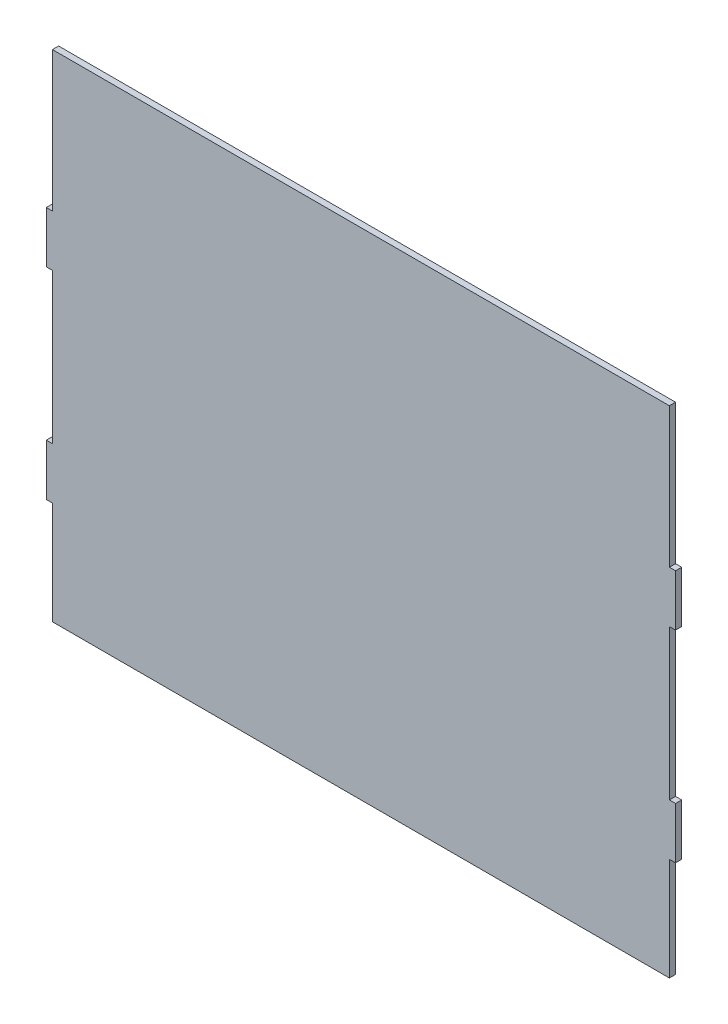
ISO-10303-21;
HEADER;
FILE_DESCRIPTION(('STEP AP214'),'2;1');
FILE_NAME('part.step','',(''),(''),'','','');
FILE_SCHEMA(('AUTOMOTIVE_DESIGN { 1 0 10303 214 1 1 1 1 }'));
ENDSEC;
DATA;
#1=APPLICATION_CONTEXT('core data for automotive mechanical design processes');
#2=APPLICATION_PROTOCOL_DEFINITION('international standard','automotive_design',2000,#1);
#3=PRODUCT_CONTEXT('',#1,'mechanical');
#4=PRODUCT('Part','Part','',(#3));
#5=PRODUCT_RELATED_PRODUCT_CATEGORY('part','',(#4));
#6=PRODUCT_DEFINITION_FORMATION('','',#4);
#7=PRODUCT_DEFINITION_CONTEXT('part definition',#1,'design');
#8=PRODUCT_DEFINITION('design','',#6,#7);
#9=PRODUCT_DEFINITION_SHAPE('','',#8);
#10=(LENGTH_UNIT() NAMED_UNIT(*) SI_UNIT(.MILLI.,.METRE.));
#11=(NAMED_UNIT(*) PLANE_ANGLE_UNIT() SI_UNIT($,.RADIAN.));
#12=(NAMED_UNIT(*) SI_UNIT($,.STERADIAN.) SOLID_ANGLE_UNIT());
#13=UNCERTAINTY_MEASURE_WITH_UNIT(LENGTH_MEASURE(1.E-05),#10,'distance_accuracy_value','');
#14=(GEOMETRIC_REPRESENTATION_CONTEXT(3) GLOBAL_UNCERTAINTY_ASSIGNED_CONTEXT((#13)) GLOBAL_UNIT_ASSIGNED_CONTEXT((#10,
#11,#12)) REPRESENTATION_CONTEXT('',''));
#15=CARTESIAN_POINT('',(0.,0.,0.));
#16=DIRECTION('',(0.,0.,1.));
#17=DIRECTION('',(1.,0.,0.));
#18=AXIS2_PLACEMENT_3D('',#15,#16,#17);
#19=CARTESIAN_POINT('',(300.,-241.,6.));
#20=DIRECTION('',(-1.,0.,0.));
#21=DIRECTION('',(0.,-1.,0.));
#22=AXIS2_PLACEMENT_3D('',#19,#20,#21);
#23=PLANE('',#22);
#24=DIRECTION('',(0.,1.,0.));
#25=VECTOR('',#24,1.);
#26=CARTESIAN_POINT('',(300.,-241.,0.));
#27=LINE('',#26,#25);
#28=CARTESIAN_POINT('',(300.,-241.,0.));
#29=VERTEX_POINT('',#28);
#30=CARTESIAN_POINT('',(300.,-141.,0.));
#31=VERTEX_POINT('',#30);
#32=EDGE_CURVE('E201',#29,#31,#27,.T.);
#33=ORIENTED_EDGE('',*,*,#32,.T.);
#34=DIRECTION('',(0.,0.,-1.));
#35=VECTOR('',#34,1.);
#36=CARTESIAN_POINT('',(300.,-141.,6.));
#37=LINE('',#36,#35);
#38=CARTESIAN_POINT('',(300.,-141.,6.));
#39=VERTEX_POINT('',#38);
#40=EDGE_CURVE('E11',#39,#31,#37,.T.);
#41=ORIENTED_EDGE('',*,*,#40,.F.);
#42=DIRECTION('',(0.,1.,0.));
#43=VECTOR('',#42,1.);
#44=CARTESIAN_POINT('',(300.,-241.,6.));
#45=LINE('',#44,#43);
#46=CARTESIAN_POINT('',(300.,-241.,6.));
#47=VERTEX_POINT('',#46);
#48=EDGE_CURVE('E239',#47,#39,#45,.T.);
#49=ORIENTED_EDGE('',*,*,#48,.F.);
#50=DIRECTION('',(0.,0.,-1.));
#51=VECTOR('',#50,1.);
#52=CARTESIAN_POINT('',(300.,-241.,6.));
#53=LINE('',#52,#51);
#54=EDGE_CURVE('E197',#47,#29,#53,.T.);
#55=ORIENTED_EDGE('',*,*,#54,.T.);
#56=EDGE_LOOP('',(#33,#41,#49,#55));
#57=FACE_BOUND('',#56,.T.);
#58=ADVANCED_FACE('F33',(#57),#23,.F.);
#59=CARTESIAN_POINT('',(300.,-141.,6.));
#60=DIRECTION('',(0.,1.,0.));
#61=DIRECTION('',(0.,0.,1.));
#62=AXIS2_PLACEMENT_3D('',#59,#60,#61);
#63=PLANE('',#62);
#64=DIRECTION('',(1.,0.,0.));
#65=VECTOR('',#64,1.);
#66=CARTESIAN_POINT('',(300.,-141.,0.));
#67=LINE('',#66,#65);
#68=CARTESIAN_POINT('',(306.,-141.,0.));
#69=VERTEX_POINT('',#68);
#70=EDGE_CURVE('E204',#31,#69,#67,.T.);
#71=ORIENTED_EDGE('',*,*,#70,.T.);
#72=DIRECTION('',(0.,0.,-1.));
#73=VECTOR('',#72,1.);
#74=CARTESIAN_POINT('',(306.,-141.,6.));
#75=LINE('',#74,#73);
#76=CARTESIAN_POINT('',(306.,-141.,6.));
#77=VERTEX_POINT('',#76);
#78=EDGE_CURVE('E41',#77,#69,#75,.T.);
#79=ORIENTED_EDGE('',*,*,#78,.F.);
#80=DIRECTION('',(1.,0.,0.));
#81=VECTOR('',#80,1.);
#82=CARTESIAN_POINT('',(300.,-141.,6.));
#83=LINE('',#82,#81);
#84=EDGE_CURVE('E128',#39,#77,#83,.T.);
#85=ORIENTED_EDGE('',*,*,#84,.F.);
#86=ORIENTED_EDGE('',*,*,#40,.T.);
#87=EDGE_LOOP('',(#71,#79,#85,#86));
#88=FACE_BOUND('',#87,.T.);
#89=ADVANCED_FACE('F357',(#88),#63,.F.);
#90=CARTESIAN_POINT('',(306.,-141.,6.));
#91=DIRECTION('',(-1.,0.,0.));
#92=DIRECTION('',(0.,0.,1.));
#93=AXIS2_PLACEMENT_3D('',#90,#91,#92);
#94=PLANE('',#93);
#95=DIRECTION('',(0.,1.,0.));
#96=VECTOR('',#95,1.);
#97=CARTESIAN_POINT('',(306.,-141.,0.));
#98=LINE('',#97,#96);
#99=CARTESIAN_POINT('',(306.,-90.9999999999999,0.));
#100=VERTEX_POINT('',#99);
#101=EDGE_CURVE('E206',#69,#100,#98,.T.);
#102=ORIENTED_EDGE('',*,*,#101,.T.);
#103=DIRECTION('',(0.,0.,-1.));
#104=VECTOR('',#103,1.);
#105=CARTESIAN_POINT('',(306.,-90.9999999999999,6.));
#106=LINE('',#105,#104);
#107=CARTESIAN_POINT('',(306.,-90.9999999999999,6.));
#108=VERTEX_POINT('',#107);
#109=EDGE_CURVE('E282',#108,#100,#106,.T.);
#110=ORIENTED_EDGE('',*,*,#109,.F.);
#111=DIRECTION('',(0.,1.,0.));
#112=VECTOR('',#111,1.);
#113=CARTESIAN_POINT('',(306.,-141.,6.));
#114=LINE('',#113,#112);
#115=EDGE_CURVE('E290',#77,#108,#114,.T.);
#116=ORIENTED_EDGE('',*,*,#115,.F.);
#117=ORIENTED_EDGE('',*,*,#78,.T.);
#118=EDGE_LOOP('',(#102,#110,#116,#117));
#119=FACE_BOUND('',#118,.T.);
#120=ADVANCED_FACE('F288',(#119),#94,.F.);
#121=CARTESIAN_POINT('',(306.,-90.9999999999999,6.));
#122=DIRECTION('',(0.,-1.,0.));
#123=DIRECTION('',(0.,0.,-1.));
#124=AXIS2_PLACEMENT_3D('',#121,#122,#123);
#125=PLANE('',#124);
#126=DIRECTION('',(-1.,0.,0.));
#127=VECTOR('',#126,1.);
#128=CARTESIAN_POINT('',(306.,-90.9999999999999,0.));
#129=LINE('',#128,#127);
#130=CARTESIAN_POINT('',(300.,-90.9999999999999,0.));
#131=VERTEX_POINT('',#130);
#132=EDGE_CURVE('E208',#100,#131,#129,.T.);
#133=ORIENTED_EDGE('',*,*,#132,.T.);
#134=DIRECTION('',(0.,0.,-1.));
#135=VECTOR('',#134,1.);
#136=CARTESIAN_POINT('',(300.,-90.9999999999999,6.));
#137=LINE('',#136,#135);
#138=CARTESIAN_POINT('',(300.,-90.9999999999999,6.));
#139=VERTEX_POINT('',#138);
#140=EDGE_CURVE('E279',#139,#131,#137,.T.);
#141=ORIENTED_EDGE('',*,*,#140,.F.);
#142=DIRECTION('',(-1.,0.,0.));
#143=VECTOR('',#142,1.);
#144=CARTESIAN_POINT('',(306.,-90.9999999999999,6.));
#145=LINE('',#144,#143);
#146=EDGE_CURVE('E308',#108,#139,#145,.T.);
#147=ORIENTED_EDGE('',*,*,#146,.F.);
#148=ORIENTED_EDGE('',*,*,#109,.T.);
#149=EDGE_LOOP('',(#133,#141,#147,#148));
#150=FACE_BOUND('',#149,.T.);
#151=ADVANCED_FACE('F299',(#150),#125,.F.);
#152=CARTESIAN_POINT('',(300.,55.,6.));
#153=DIRECTION('',(-1.,0.,0.));
#154=DIRECTION('',(0.,-1.,0.));
#155=AXIS2_PLACEMENT_3D('',#152,#153,#154);
#156=PLANE('',#155);
#157=DIRECTION('',(0.,1.,0.));
#158=VECTOR('',#157,1.);
#159=CARTESIAN_POINT('',(300.,55.,0.));
#160=LINE('',#159,#158);
#161=CARTESIAN_POINT('',(300.,55.,0.));
#162=VERTEX_POINT('',#161);
#163=EDGE_CURVE('E210',#131,#162,#160,.T.);
#164=ORIENTED_EDGE('',*,*,#163,.T.);
#165=DIRECTION('',(0.,0.,-1.));
#166=VECTOR('',#165,1.);
#167=CARTESIAN_POINT('',(300.,55.,6.));
#168=LINE('',#167,#166);
#169=CARTESIAN_POINT('',(300.,55.,6.));
#170=VERTEX_POINT('',#169);
#171=EDGE_CURVE('E276',#170,#162,#168,.T.);
#172=ORIENTED_EDGE('',*,*,#171,.F.);
#173=DIRECTION('',(0.,1.,0.));
#174=VECTOR('',#173,1.);
#175=CARTESIAN_POINT('',(300.,55.,6.));
#176=LINE('',#175,#174);
#177=EDGE_CURVE('E305',#139,#170,#176,.T.);
#178=ORIENTED_EDGE('',*,*,#177,.F.);
#179=ORIENTED_EDGE('',*,*,#140,.T.);
#180=EDGE_LOOP('',(#164,#172,#178,#179));
#181=FACE_BOUND('',#180,.T.);
#182=ADVANCED_FACE('F303',(#181),#156,.F.);
#183=CARTESIAN_POINT('',(306.,55.,6.));
#184=DIRECTION('',(0.,1.,0.));
#185=DIRECTION('',(0.,0.,1.));
#186=AXIS2_PLACEMENT_3D('',#183,#184,#185);
#187=PLANE('',#186);
#188=DIRECTION('',(1.,0.,0.));
#189=VECTOR('',#188,1.);
#190=CARTESIAN_POINT('',(306.,55.,0.));
#191=LINE('',#190,#189);
#192=CARTESIAN_POINT('',(306.,55.,0.));
#193=VERTEX_POINT('',#192);
#194=EDGE_CURVE('E212',#162,#193,#191,.T.);
#195=ORIENTED_EDGE('',*,*,#194,.T.);
#196=DIRECTION('',(0.,0.,-1.));
#197=VECTOR('',#196,1.);
#198=CARTESIAN_POINT('',(306.,55.,6.));
#199=LINE('',#198,#197);
#200=CARTESIAN_POINT('',(306.,55.,6.));
#201=VERTEX_POINT('',#200);
#202=EDGE_CURVE('E273',#201,#193,#199,.T.);
#203=ORIENTED_EDGE('',*,*,#202,.F.);
#204=DIRECTION('',(1.,0.,0.));
#205=VECTOR('',#204,1.);
#206=CARTESIAN_POINT('',(306.,55.,6.));
#207=LINE('',#206,#205);
#208=EDGE_CURVE('E307',#170,#201,#207,.T.);
#209=ORIENTED_EDGE('',*,*,#208,.F.);
#210=ORIENTED_EDGE('',*,*,#171,.T.);
#211=EDGE_LOOP('',(#195,#203,#209,#210));
#212=FACE_BOUND('',#211,.T.);
#213=ADVANCED_FACE('F370',(#212),#187,.F.);
#214=CARTESIAN_POINT('',(306.,105.,6.));
#215=DIRECTION('',(-1.,0.,0.));
#216=DIRECTION('',(0.,0.,1.));
#217=AXIS2_PLACEMENT_3D('',#214,#215,#216);
#218=PLANE('',#217);
#219=DIRECTION('',(0.,1.,0.));
#220=VECTOR('',#219,1.);
#221=CARTESIAN_POINT('',(306.,105.,0.));
#222=LINE('',#221,#220);
#223=CARTESIAN_POINT('',(306.,105.,0.));
#224=VERTEX_POINT('',#223);
#225=EDGE_CURVE('E214',#193,#224,#222,.T.);
#226=ORIENTED_EDGE('',*,*,#225,.T.);
#227=DIRECTION('',(0.,0.,-1.));
#228=VECTOR('',#227,1.);
#229=CARTESIAN_POINT('',(306.,105.,6.));
#230=LINE('',#229,#228);
#231=CARTESIAN_POINT('',(306.,105.,6.));
#232=VERTEX_POINT('',#231);
#233=EDGE_CURVE('E270',#232,#224,#230,.T.);
#234=ORIENTED_EDGE('',*,*,#233,.F.);
#235=DIRECTION('',(0.,1.,0.));
#236=VECTOR('',#235,1.);
#237=CARTESIAN_POINT('',(306.,105.,6.));
#238=LINE('',#237,#236);
#239=EDGE_CURVE('E310',#201,#232,#238,.T.);
#240=ORIENTED_EDGE('',*,*,#239,.F.);
#241=ORIENTED_EDGE('',*,*,#202,.T.);
#242=EDGE_LOOP('',(#226,#234,#240,#241));
#243=FACE_BOUND('',#242,.T.);
#244=ADVANCED_FACE('F373',(#243),#218,.F.);
#245=CARTESIAN_POINT('',(306.,105.,6.));
#246=DIRECTION('',(0.,-1.,0.));
#247=DIRECTION('',(1.,0.,0.));
#248=AXIS2_PLACEMENT_3D('',#245,#246,#247);
#249=PLANE('',#248);
#250=DIRECTION('',(-1.,0.,0.));
#251=VECTOR('',#250,1.);
#252=CARTESIAN_POINT('',(306.,105.,0.));
#253=LINE('',#252,#251);
#254=CARTESIAN_POINT('',(300.,105.,0.));
#255=VERTEX_POINT('',#254);
#256=EDGE_CURVE('E216',#224,#255,#253,.T.);
#257=ORIENTED_EDGE('',*,*,#256,.T.);
#258=DIRECTION('',(0.,0.,-1.));
#259=VECTOR('',#258,1.);
#260=CARTESIAN_POINT('',(300.,105.,6.));
#261=LINE('',#260,#259);
#262=CARTESIAN_POINT('',(300.,105.,6.));
#263=VERTEX_POINT('',#262);
#264=EDGE_CURVE('E267',#263,#255,#261,.T.);
#265=ORIENTED_EDGE('',*,*,#264,.F.);
#266=DIRECTION('',(-1.,0.,0.));
#267=VECTOR('',#266,1.);
#268=CARTESIAN_POINT('',(306.,105.,6.));
#269=LINE('',#268,#267);
#270=EDGE_CURVE('E316',#232,#263,#269,.T.);
#271=ORIENTED_EDGE('',*,*,#270,.F.);
#272=ORIENTED_EDGE('',*,*,#233,.T.);
#273=EDGE_LOOP('',(#257,#265,#271,#272));
#274=FACE_BOUND('',#273,.T.);
#275=ADVANCED_FACE('F377',(#274),#249,.F.);
#276=CARTESIAN_POINT('',(300.,241.,6.));
#277=DIRECTION('',(-1.,0.,0.));
#278=DIRECTION('',(0.,0.,1.));
#279=AXIS2_PLACEMENT_3D('',#276,#277,#278);
#280=PLANE('',#279);
#281=DIRECTION('',(0.,1.,0.));
#282=VECTOR('',#281,1.);
#283=CARTESIAN_POINT('',(300.,241.,0.));
#284=LINE('',#283,#282);
#285=CARTESIAN_POINT('',(300.,241.,0.));
#286=VERTEX_POINT('',#285);
#287=EDGE_CURVE('E218',#255,#286,#284,.T.);
#288=ORIENTED_EDGE('',*,*,#287,.T.);
#289=DIRECTION('',(0.,0.,-1.));
#290=VECTOR('',#289,1.);
#291=CARTESIAN_POINT('',(300.,241.,6.));
#292=LINE('',#291,#290);
#293=CARTESIAN_POINT('',(300.,241.,6.));
#294=VERTEX_POINT('',#293);
#295=EDGE_CURVE('E264',#294,#286,#292,.T.);
#296=ORIENTED_EDGE('',*,*,#295,.F.);
#297=DIRECTION('',(0.,1.,0.));
#298=VECTOR('',#297,1.);
#299=CARTESIAN_POINT('',(300.,241.,6.));
#300=LINE('',#299,#298);
#301=EDGE_CURVE('E318',#263,#294,#300,.T.);
#302=ORIENTED_EDGE('',*,*,#301,.F.);
#303=ORIENTED_EDGE('',*,*,#264,.T.);
#304=EDGE_LOOP('',(#288,#296,#302,#303));
#305=FACE_BOUND('',#304,.T.);
#306=ADVANCED_FACE('F381',(#305),#280,.F.);
#307=CARTESIAN_POINT('',(-300.,241.,6.));
#308=DIRECTION('',(0.,-1.,0.));
#309=DIRECTION('',(1.,0.,0.));
#310=AXIS2_PLACEMENT_3D('',#307,#308,#309);
#311=PLANE('',#310);
#312=DIRECTION('',(-1.,0.,0.));
#313=VECTOR('',#312,1.);
#314=CARTESIAN_POINT('',(-300.,241.,0.));
#315=LINE('',#314,#313);
#316=CARTESIAN_POINT('',(-300.,241.,0.));
#317=VERTEX_POINT('',#316);
#318=EDGE_CURVE('E220',#286,#317,#315,.T.);
#319=ORIENTED_EDGE('',*,*,#318,.T.);
#320=DIRECTION('',(0.,0.,-1.));
#321=VECTOR('',#320,1.);
#322=CARTESIAN_POINT('',(-300.,241.,6.));
#323=LINE('',#322,#321);
#324=CARTESIAN_POINT('',(-300.,241.,6.));
#325=VERTEX_POINT('',#324);
#326=EDGE_CURVE('E261',#325,#317,#323,.T.);
#327=ORIENTED_EDGE('',*,*,#326,.F.);
#328=DIRECTION('',(-1.,0.,0.));
#329=VECTOR('',#328,1.);
#330=CARTESIAN_POINT('',(-300.,241.,6.));
#331=LINE('',#330,#329);
#332=EDGE_CURVE('E320',#294,#325,#331,.T.);
#333=ORIENTED_EDGE('',*,*,#332,.F.);
#334=ORIENTED_EDGE('',*,*,#295,.T.);
#335=EDGE_LOOP('',(#319,#327,#333,#334));
#336=FACE_BOUND('',#335,.T.);
#337=ADVANCED_FACE('F385',(#336),#311,.F.);
#338=CARTESIAN_POINT('',(-300.,241.,6.));
#339=DIRECTION('',(1.,0.,0.));
#340=DIRECTION('',(0.,0.,-1.));
#341=AXIS2_PLACEMENT_3D('',#338,#339,#340);
#342=PLANE('',#341);
#343=DIRECTION('',(0.,-1.,0.));
#344=VECTOR('',#343,1.);
#345=CARTESIAN_POINT('',(-300.,241.,0.));
#346=LINE('',#345,#344);
#347=CARTESIAN_POINT('',(-300.,105.,0.));
#348=VERTEX_POINT('',#347);
#349=EDGE_CURVE('E222',#317,#348,#346,.T.);
#350=ORIENTED_EDGE('',*,*,#349,.T.);
#351=DIRECTION('',(0.,0.,-1.));
#352=VECTOR('',#351,1.);
#353=CARTESIAN_POINT('',(-300.,105.,6.));
#354=LINE('',#353,#352);
#355=CARTESIAN_POINT('',(-300.,105.,6.));
#356=VERTEX_POINT('',#355);
#357=EDGE_CURVE('E258',#356,#348,#354,.T.);
#358=ORIENTED_EDGE('',*,*,#357,.F.);
#359=DIRECTION('',(0.,-1.,0.));
#360=VECTOR('',#359,1.);
#361=CARTESIAN_POINT('',(-300.,241.,6.));
#362=LINE('',#361,#360);
#363=EDGE_CURVE('E322',#325,#356,#362,.T.);
#364=ORIENTED_EDGE('',*,*,#363,.F.);
#365=ORIENTED_EDGE('',*,*,#326,.T.);
#366=EDGE_LOOP('',(#350,#358,#364,#365));
#367=FACE_BOUND('',#366,.T.);
#368=ADVANCED_FACE('F389',(#367),#342,.F.);
#369=CARTESIAN_POINT('',(-306.,105.,6.));
#370=DIRECTION('',(0.,-1.,0.));
#371=DIRECTION('',(0.,0.,-1.));
#372=AXIS2_PLACEMENT_3D('',#369,#370,#371);
#373=PLANE('',#372);
#374=DIRECTION('',(-1.,0.,0.));
#375=VECTOR('',#374,1.);
#376=CARTESIAN_POINT('',(-306.,105.,0.));
#377=LINE('',#376,#375);
#378=CARTESIAN_POINT('',(-306.,105.,0.));
#379=VERTEX_POINT('',#378);
#380=EDGE_CURVE('E224',#348,#379,#377,.T.);
#381=ORIENTED_EDGE('',*,*,#380,.T.);
#382=DIRECTION('',(0.,0.,-1.));
#383=VECTOR('',#382,1.);
#384=CARTESIAN_POINT('',(-306.,105.,6.));
#385=LINE('',#384,#383);
#386=CARTESIAN_POINT('',(-306.,105.,6.));
#387=VERTEX_POINT('',#386);
#388=EDGE_CURVE('E255',#387,#379,#385,.T.);
#389=ORIENTED_EDGE('',*,*,#388,.F.);
#390=DIRECTION('',(-1.,0.,0.));
#391=VECTOR('',#390,1.);
#392=CARTESIAN_POINT('',(-306.,105.,6.));
#393=LINE('',#392,#391);
#394=EDGE_CURVE('E324',#356,#387,#393,.T.);
#395=ORIENTED_EDGE('',*,*,#394,.F.);
#396=ORIENTED_EDGE('',*,*,#357,.T.);
#397=EDGE_LOOP('',(#381,#389,#395,#396));
#398=FACE_BOUND('',#397,.T.);
#399=ADVANCED_FACE('F393',(#398),#373,.F.);
#400=CARTESIAN_POINT('',(-306.,105.,6.));
#401=DIRECTION('',(1.,0.,0.));
#402=DIRECTION('',(0.,0.,-1.));
#403=AXIS2_PLACEMENT_3D('',#400,#401,#402);
#404=PLANE('',#403);
#405=DIRECTION('',(0.,-1.,0.));
#406=VECTOR('',#405,1.);
#407=CARTESIAN_POINT('',(-306.,105.,0.));
#408=LINE('',#407,#406);
#409=CARTESIAN_POINT('',(-306.,55.,0.));
#410=VERTEX_POINT('',#409);
#411=EDGE_CURVE('E226',#379,#410,#408,.T.);
#412=ORIENTED_EDGE('',*,*,#411,.T.);
#413=DIRECTION('',(0.,0.,-1.));
#414=VECTOR('',#413,1.);
#415=CARTESIAN_POINT('',(-306.,55.,6.));
#416=LINE('',#415,#414);
#417=CARTESIAN_POINT('',(-306.,55.,6.));
#418=VERTEX_POINT('',#417);
#419=EDGE_CURVE('E252',#418,#410,#416,.T.);
#420=ORIENTED_EDGE('',*,*,#419,.F.);
#421=DIRECTION('',(0.,-1.,0.));
#422=VECTOR('',#421,1.);
#423=CARTESIAN_POINT('',(-306.,105.,6.));
#424=LINE('',#423,#422);
#425=EDGE_CURVE('E326',#387,#418,#424,.T.);
#426=ORIENTED_EDGE('',*,*,#425,.F.);
#427=ORIENTED_EDGE('',*,*,#388,.T.);
#428=EDGE_LOOP('',(#412,#420,#426,#427));
#429=FACE_BOUND('',#428,.T.);
#430=ADVANCED_FACE('F397',(#429),#404,.F.);
#431=CARTESIAN_POINT('',(-306.,55.,6.));
#432=DIRECTION('',(0.,1.,0.));
#433=DIRECTION('',(0.,0.,1.));
#434=AXIS2_PLACEMENT_3D('',#431,#432,#433);
#435=PLANE('',#434);
#436=DIRECTION('',(1.,0.,0.));
#437=VECTOR('',#436,1.);
#438=CARTESIAN_POINT('',(-306.,55.,0.));
#439=LINE('',#438,#437);
#440=CARTESIAN_POINT('',(-300.,55.,0.));
#441=VERTEX_POINT('',#440);
#442=EDGE_CURVE('E228',#410,#441,#439,.T.);
#443=ORIENTED_EDGE('',*,*,#442,.T.);
#444=DIRECTION('',(0.,0.,-1.));
#445=VECTOR('',#444,1.);
#446=CARTESIAN_POINT('',(-300.,55.,6.));
#447=LINE('',#446,#445);
#448=CARTESIAN_POINT('',(-300.,55.,6.));
#449=VERTEX_POINT('',#448);
#450=EDGE_CURVE('E249',#449,#441,#447,.T.);
#451=ORIENTED_EDGE('',*,*,#450,.F.);
#452=DIRECTION('',(1.,0.,0.));
#453=VECTOR('',#452,1.);
#454=CARTESIAN_POINT('',(-306.,55.,6.));
#455=LINE('',#454,#453);
#456=EDGE_CURVE('E328',#418,#449,#455,.T.);
#457=ORIENTED_EDGE('',*,*,#456,.F.);
#458=ORIENTED_EDGE('',*,*,#419,.T.);
#459=EDGE_LOOP('',(#443,#451,#457,#458));
#460=FACE_BOUND('',#459,.T.);
#461=ADVANCED_FACE('F401',(#460),#435,.F.);
#462=CARTESIAN_POINT('',(-300.,55.,6.));
#463=DIRECTION('',(1.,0.,0.));
#464=DIRECTION('',(0.,0.,-1.));
#465=AXIS2_PLACEMENT_3D('',#462,#463,#464);
#466=PLANE('',#465);
#467=DIRECTION('',(0.,-1.,0.));
#468=VECTOR('',#467,1.);
#469=CARTESIAN_POINT('',(-300.,55.,0.));
#470=LINE('',#469,#468);
#471=CARTESIAN_POINT('',(-300.,-91.,0.));
#472=VERTEX_POINT('',#471);
#473=EDGE_CURVE('E230',#441,#472,#470,.T.);
#474=ORIENTED_EDGE('',*,*,#473,.T.);
#475=DIRECTION('',(0.,0.,-1.));
#476=VECTOR('',#475,1.);
#477=CARTESIAN_POINT('',(-300.,-91.,6.));
#478=LINE('',#477,#476);
#479=CARTESIAN_POINT('',(-300.,-91.,6.));
#480=VERTEX_POINT('',#479);
#481=EDGE_CURVE('E246',#480,#472,#478,.T.);
#482=ORIENTED_EDGE('',*,*,#481,.F.);
#483=DIRECTION('',(0.,-1.,0.));
#484=VECTOR('',#483,1.);
#485=CARTESIAN_POINT('',(-300.,55.,6.));
#486=LINE('',#485,#484);
#487=EDGE_CURVE('E330',#449,#480,#486,.T.);
#488=ORIENTED_EDGE('',*,*,#487,.F.);
#489=ORIENTED_EDGE('',*,*,#450,.T.);
#490=EDGE_LOOP('',(#474,#482,#488,#489));
#491=FACE_BOUND('',#490,.T.);
#492=ADVANCED_FACE('F405',(#491),#466,.F.);
#493=CARTESIAN_POINT('',(-306.,-91.,6.));
#494=DIRECTION('',(0.,-1.,0.));
#495=DIRECTION('',(0.,0.,-1.));
#496=AXIS2_PLACEMENT_3D('',#493,#494,#495);
#497=PLANE('',#496);
#498=DIRECTION('',(-1.,0.,0.));
#499=VECTOR('',#498,1.);
#500=CARTESIAN_POINT('',(-306.,-91.,0.));
#501=LINE('',#500,#499);
#502=CARTESIAN_POINT('',(-306.,-91.,0.));
#503=VERTEX_POINT('',#502);
#504=EDGE_CURVE('E232',#472,#503,#501,.T.);
#505=ORIENTED_EDGE('',*,*,#504,.T.);
#506=DIRECTION('',(0.,0.,-1.));
#507=VECTOR('',#506,1.);
#508=CARTESIAN_POINT('',(-306.,-91.,6.));
#509=LINE('',#508,#507);
#510=CARTESIAN_POINT('',(-306.,-91.,6.));
#511=VERTEX_POINT('',#510);
#512=EDGE_CURVE('E243',#511,#503,#509,.T.);
#513=ORIENTED_EDGE('',*,*,#512,.F.);
#514=DIRECTION('',(-1.,0.,0.));
#515=VECTOR('',#514,1.);
#516=CARTESIAN_POINT('',(-306.,-91.,6.));
#517=LINE('',#516,#515);
#518=EDGE_CURVE('E332',#480,#511,#517,.T.);
#519=ORIENTED_EDGE('',*,*,#518,.F.);
#520=ORIENTED_EDGE('',*,*,#481,.T.);
#521=EDGE_LOOP('',(#505,#513,#519,#520));
#522=FACE_BOUND('',#521,.T.);
#523=ADVANCED_FACE('F338',(#522),#497,.F.);
#524=CARTESIAN_POINT('',(-306.,-141.,6.));
#525=DIRECTION('',(1.,0.,0.));
#526=DIRECTION('',(0.,0.,-1.));
#527=AXIS2_PLACEMENT_3D('',#524,#525,#526);
#528=PLANE('',#527);
#529=DIRECTION('',(0.,-1.,0.));
#530=VECTOR('',#529,1.);
#531=CARTESIAN_POINT('',(-306.,-141.,0.));
#532=LINE('',#531,#530);
#533=CARTESIAN_POINT('',(-306.,-141.,0.));
#534=VERTEX_POINT('',#533);
#535=EDGE_CURVE('E234',#503,#534,#532,.T.);
#536=ORIENTED_EDGE('',*,*,#535,.T.);
#537=DIRECTION('',(0.,0.,-1.));
#538=VECTOR('',#537,1.);
#539=CARTESIAN_POINT('',(-306.,-141.,6.));
#540=LINE('',#539,#538);
#541=CARTESIAN_POINT('',(-306.,-141.,6.));
#542=VERTEX_POINT('',#541);
#543=EDGE_CURVE('E192',#542,#534,#540,.T.);
#544=ORIENTED_EDGE('',*,*,#543,.F.);
#545=DIRECTION('',(0.,-1.,0.));
#546=VECTOR('',#545,1.);
#547=CARTESIAN_POINT('',(-306.,-141.,6.));
#548=LINE('',#547,#546);
#549=EDGE_CURVE('E183',#511,#542,#548,.T.);
#550=ORIENTED_EDGE('',*,*,#549,.F.);
#551=ORIENTED_EDGE('',*,*,#512,.T.);
#552=EDGE_LOOP('',(#536,#544,#550,#551));
#553=FACE_BOUND('',#552,.T.);
#554=ADVANCED_FACE('F342',(#553),#528,.F.);
#555=CARTESIAN_POINT('',(-306.,-141.,6.));
#556=DIRECTION('',(0.,1.,0.));
#557=DIRECTION('',(0.,0.,1.));
#558=AXIS2_PLACEMENT_3D('',#555,#556,#557);
#559=PLANE('',#558);
#560=DIRECTION('',(1.,0.,0.));
#561=VECTOR('',#560,1.);
#562=CARTESIAN_POINT('',(-306.,-141.,0.));
#563=LINE('',#562,#561);
#564=CARTESIAN_POINT('',(-300.,-141.,0.));
#565=VERTEX_POINT('',#564);
#566=EDGE_CURVE('E191',#534,#565,#563,.T.);
#567=ORIENTED_EDGE('',*,*,#566,.T.);
#568=DIRECTION('',(0.,0.,-1.));
#569=VECTOR('',#568,1.);
#570=CARTESIAN_POINT('',(-300.,-141.,6.));
#571=LINE('',#570,#569);
#572=CARTESIAN_POINT('',(-300.,-141.,6.));
#573=VERTEX_POINT('',#572);
#574=EDGE_CURVE('E188',#573,#565,#571,.T.);
#575=ORIENTED_EDGE('',*,*,#574,.F.);
#576=DIRECTION('',(1.,0.,0.));
#577=VECTOR('',#576,1.);
#578=CARTESIAN_POINT('',(-306.,-141.,6.));
#579=LINE('',#578,#577);
#580=EDGE_CURVE('E177',#542,#573,#579,.T.);
#581=ORIENTED_EDGE('',*,*,#580,.F.);
#582=ORIENTED_EDGE('',*,*,#543,.T.);
#583=EDGE_LOOP('',(#567,#575,#581,#582));
#584=FACE_BOUND('',#583,.T.);
#585=ADVANCED_FACE('F189',(#584),#559,.F.);
#586=CARTESIAN_POINT('',(-300.,-141.,6.));
#587=DIRECTION('',(1.,0.,0.));
#588=DIRECTION('',(0.,1.,0.));
#589=AXIS2_PLACEMENT_3D('',#586,#587,#588);
#590=PLANE('',#589);
#591=DIRECTION('',(0.,-1.,0.));
#592=VECTOR('',#591,1.);
#593=CARTESIAN_POINT('',(-300.,-141.,0.));
#594=LINE('',#593,#592);
#595=CARTESIAN_POINT('',(-300.,-241.,0.));
#596=VERTEX_POINT('',#595);
#597=EDGE_CURVE('E114',#565,#596,#594,.T.);
#598=ORIENTED_EDGE('',*,*,#597,.T.);
#599=DIRECTION('',(0.,0.,-1.));
#600=VECTOR('',#599,1.);
#601=CARTESIAN_POINT('',(-300.,-241.,6.));
#602=LINE('',#601,#600);
#603=CARTESIAN_POINT('',(-300.,-241.,6.));
#604=VERTEX_POINT('',#603);
#605=EDGE_CURVE('E193',#604,#596,#602,.T.);
#606=ORIENTED_EDGE('',*,*,#605,.F.);
#607=DIRECTION('',(0.,-1.,0.));
#608=VECTOR('',#607,1.);
#609=CARTESIAN_POINT('',(-300.,-141.,6.));
#610=LINE('',#609,#608);
#611=EDGE_CURVE('E181',#573,#604,#610,.T.);
#612=ORIENTED_EDGE('',*,*,#611,.F.);
#613=ORIENTED_EDGE('',*,*,#574,.T.);
#614=EDGE_LOOP('',(#598,#606,#612,#613));
#615=FACE_BOUND('',#614,.T.);
#616=ADVANCED_FACE('F195',(#615),#590,.F.);
#617=CARTESIAN_POINT('',(-300.,-241.,6.));
#618=DIRECTION('',(0.,1.,0.));
#619=DIRECTION('',(-1.,0.,0.));
#620=AXIS2_PLACEMENT_3D('',#617,#618,#619);
#621=PLANE('',#620);
#622=DIRECTION('',(1.,0.,0.));
#623=VECTOR('',#622,1.);
#624=CARTESIAN_POINT('',(-300.,-241.,0.));
#625=LINE('',#624,#623);
#626=EDGE_CURVE('E120',#596,#29,#625,.T.);
#627=ORIENTED_EDGE('',*,*,#626,.T.);
#628=ORIENTED_EDGE('',*,*,#54,.F.);
#629=DIRECTION('',(1.,0.,0.));
#630=VECTOR('',#629,1.);
#631=CARTESIAN_POINT('',(-300.,-241.,6.));
#632=LINE('',#631,#630);
#633=EDGE_CURVE('E49',#604,#47,#632,.T.);
#634=ORIENTED_EDGE('',*,*,#633,.F.);
#635=ORIENTED_EDGE('',*,*,#605,.T.);
#636=EDGE_LOOP('',(#627,#628,#634,#635));
#637=FACE_BOUND('',#636,.T.);
#638=ADVANCED_FACE('F346',(#637),#621,.F.);
#639=CARTESIAN_POINT('',(0.,0.,6.));
#640=DIRECTION('',(0.,0.,-1.));
#641=DIRECTION('',(-1.,0.,0.));
#642=AXIS2_PLACEMENT_3D('',#639,#640,#641);
#643=PLANE('',#642);
#644=ORIENTED_EDGE('',*,*,#48,.T.);
#645=ORIENTED_EDGE('',*,*,#84,.T.);
#646=ORIENTED_EDGE('',*,*,#115,.T.);
#647=ORIENTED_EDGE('',*,*,#146,.T.);
#648=ORIENTED_EDGE('',*,*,#177,.T.);
#649=ORIENTED_EDGE('',*,*,#208,.T.);
#650=ORIENTED_EDGE('',*,*,#239,.T.);
#651=ORIENTED_EDGE('',*,*,#270,.T.);
#652=ORIENTED_EDGE('',*,*,#301,.T.);
#653=ORIENTED_EDGE('',*,*,#332,.T.);
#654=ORIENTED_EDGE('',*,*,#363,.T.);
#655=ORIENTED_EDGE('',*,*,#394,.T.);
#656=ORIENTED_EDGE('',*,*,#425,.T.);
#657=ORIENTED_EDGE('',*,*,#456,.T.);
#658=ORIENTED_EDGE('',*,*,#487,.T.);
#659=ORIENTED_EDGE('',*,*,#518,.T.);
#660=ORIENTED_EDGE('',*,*,#549,.T.);
#661=ORIENTED_EDGE('',*,*,#580,.T.);
#662=ORIENTED_EDGE('',*,*,#611,.T.);
#663=ORIENTED_EDGE('',*,*,#633,.T.);
#664=EDGE_LOOP('',(#644,#645,#646,#647,#648,#649,#650,#651,#652,#653,#654,#655,#656,#657,#658,
#659,#660,#661,#662,#663));
#665=FACE_BOUND('',#664,.T.);
#666=ADVANCED_FACE('F179',(#665),#643,.F.);
#667=CARTESIAN_POINT('',(0.,0.,0.));
#668=DIRECTION('',(0.,0.,-1.));
#669=DIRECTION('',(-1.,0.,0.));
#670=AXIS2_PLACEMENT_3D('',#667,#668,#669);
#671=PLANE('',#670);
#672=ORIENTED_EDGE('',*,*,#32,.F.);
#673=ORIENTED_EDGE('',*,*,#626,.F.);
#674=ORIENTED_EDGE('',*,*,#597,.F.);
#675=ORIENTED_EDGE('',*,*,#566,.F.);
#676=ORIENTED_EDGE('',*,*,#535,.F.);
#677=ORIENTED_EDGE('',*,*,#504,.F.);
#678=ORIENTED_EDGE('',*,*,#473,.F.);
#679=ORIENTED_EDGE('',*,*,#442,.F.);
#680=ORIENTED_EDGE('',*,*,#411,.F.);
#681=ORIENTED_EDGE('',*,*,#380,.F.);
#682=ORIENTED_EDGE('',*,*,#349,.F.);
#683=ORIENTED_EDGE('',*,*,#318,.F.);
#684=ORIENTED_EDGE('',*,*,#287,.F.);
#685=ORIENTED_EDGE('',*,*,#256,.F.);
#686=ORIENTED_EDGE('',*,*,#225,.F.);
#687=ORIENTED_EDGE('',*,*,#194,.F.);
#688=ORIENTED_EDGE('',*,*,#163,.F.);
#689=ORIENTED_EDGE('',*,*,#132,.F.);
#690=ORIENTED_EDGE('',*,*,#101,.F.);
#691=ORIENTED_EDGE('',*,*,#70,.F.);
#692=EDGE_LOOP('',(#672,#673,#674,#675,#676,#677,#678,#679,#680,#681,#682,#683,#684,#685,#686,
#687,#688,#689,#690,#691));
#693=FACE_BOUND('',#692,.T.);
#694=ADVANCED_FACE('F294',(#693),#671,.T.);
#695=CLOSED_SHELL('',(#58,#89,#120,#151,#182,#213,#244,#275,#306,#337,#368,#399,#430,#461,#492,
#523,#554,#585,#616,#638,#666,#694));
#696=MANIFOLD_SOLID_BREP('B2',#695);
#697=ADVANCED_BREP_SHAPE_REPRESENTATION('',(#18,#696),#14);
#698=SHAPE_DEFINITION_REPRESENTATION(#9,#697);
ENDSEC;
END-ISO-10303-21;
